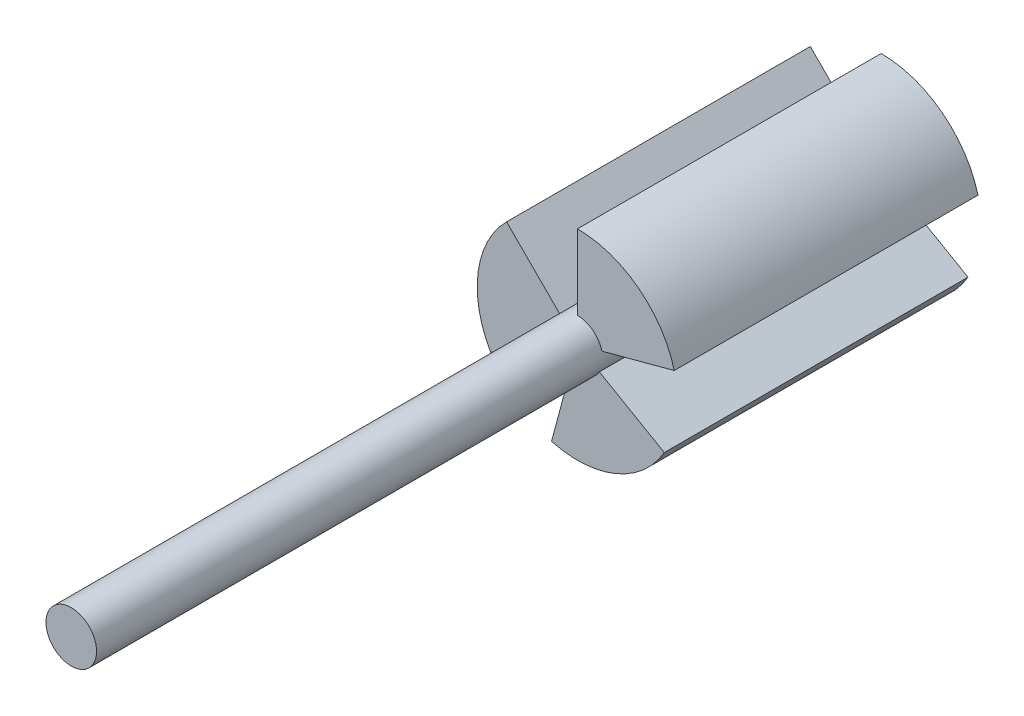
ISO-10303-21;
HEADER;
FILE_DESCRIPTION(('STEP AP214'),'2;1');
FILE_NAME('part.step','',(''),(''),'','','');
FILE_SCHEMA(('AUTOMOTIVE_DESIGN { 1 0 10303 214 1 1 1 1 }'));
ENDSEC;
DATA;
#1=APPLICATION_CONTEXT('core data for automotive mechanical design processes');
#2=APPLICATION_PROTOCOL_DEFINITION('international standard','automotive_design',2000,#1);
#3=PRODUCT_CONTEXT('',#1,'mechanical');
#4=PRODUCT('Part','Part','',(#3));
#5=PRODUCT_RELATED_PRODUCT_CATEGORY('part','',(#4));
#6=PRODUCT_DEFINITION_FORMATION('','',#4);
#7=PRODUCT_DEFINITION_CONTEXT('part definition',#1,'design');
#8=PRODUCT_DEFINITION('design','',#6,#7);
#9=PRODUCT_DEFINITION_SHAPE('','',#8);
#10=(LENGTH_UNIT() NAMED_UNIT(*) SI_UNIT(.MILLI.,.METRE.));
#11=(NAMED_UNIT(*) PLANE_ANGLE_UNIT() SI_UNIT($,.RADIAN.));
#12=(NAMED_UNIT(*) SI_UNIT($,.STERADIAN.) SOLID_ANGLE_UNIT());
#13=UNCERTAINTY_MEASURE_WITH_UNIT(LENGTH_MEASURE(1.E-05),#10,'distance_accuracy_value','');
#14=(GEOMETRIC_REPRESENTATION_CONTEXT(3) GLOBAL_UNCERTAINTY_ASSIGNED_CONTEXT((#13)) GLOBAL_UNIT_ASSIGNED_CONTEXT((#10,
#11,#12)) REPRESENTATION_CONTEXT('',''));
#15=CARTESIAN_POINT('',(0.,0.,0.));
#16=DIRECTION('',(0.,0.,1.));
#17=DIRECTION('',(1.,0.,0.));
#18=AXIS2_PLACEMENT_3D('',#15,#16,#17);
#19=CARTESIAN_POINT('',(0.,0.,762.));
#20=DIRECTION('',(0.,0.,1.));
#21=DIRECTION('',(1.,0.,0.));
#22=AXIS2_PLACEMENT_3D('',#19,#20,#21);
#23=PLANE('',#22);
#24=CARTESIAN_POINT('',(0.,0.,762.));
#25=DIRECTION('',(0.,0.,1.));
#26=DIRECTION('',(1.,0.,0.));
#27=AXIS2_PLACEMENT_3D('',#24,#25,#26);
#28=CIRCLE('',#27,63.5);
#29=CARTESIAN_POINT('',(61.336289969356,16.4350093640095,762.));
#30=VERTEX_POINT('',#29);
#31=CARTESIAN_POINT('',(0.,63.5,762.));
#32=VERTEX_POINT('',#31);
#33=EDGE_CURVE('E44',#30,#32,#28,.T.);
#34=ORIENTED_EDGE('',*,*,#33,.F.);
#35=DIRECTION('',(-0.965925826289071,-0.258819045102511,0.));
#36=VECTOR('',#35,1.);
#37=CARTESIAN_POINT('',(61.3362899693559,16.4350093640095,762.));
#38=LINE('',#37,#36);
#39=CARTESIAN_POINT('',(242.89170827865,65.0826370814776,762.));
#40=VERTEX_POINT('',#39);
#41=EDGE_CURVE('E129',#40,#30,#38,.T.);
#42=ORIENTED_EDGE('',*,*,#41,.F.);
#43=CARTESIAN_POINT('',(0.,0.,762.));
#44=DIRECTION('',(0.,0.,1.));
#45=DIRECTION('',(1.,0.,0.));
#46=AXIS2_PLACEMENT_3D('',#43,#44,#45);
#47=CIRCLE('',#46,251.46);
#48=CARTESIAN_POINT('',(0.,251.46,762.));
#49=VERTEX_POINT('',#48);
#50=EDGE_CURVE('E205',#40,#49,#47,.T.);
#51=ORIENTED_EDGE('',*,*,#50,.T.);
#52=DIRECTION('',(0.,1.,0.));
#53=VECTOR('',#52,1.);
#54=CARTESIAN_POINT('',(0.,251.46,762.));
#55=LINE('',#54,#53);
#56=EDGE_CURVE('E131',#32,#49,#55,.T.);
#57=ORIENTED_EDGE('',*,*,#56,.F.);
#58=EDGE_LOOP('',(#34,#42,#51,#57));
#59=FACE_BOUND('',#58,.T.);
#60=ADVANCED_FACE('F33',(#59),#23,.T.);
#61=CARTESIAN_POINT('',(-44.9012806053453,44.9012806053462,762.));
#62=VERTEX_POINT('',#61);
#63=CARTESIAN_POINT('',(-54.9926131403121,-31.7499999999995,762.));
#64=VERTEX_POINT('',#63);
#65=EDGE_CURVE('E11',#62,#64,#28,.T.);
#66=ORIENTED_EDGE('',*,*,#65,.F.);
#67=DIRECTION('',(0.70710678118654,-0.707106781186555,0.));
#68=VECTOR('',#67,1.);
#69=CARTESIAN_POINT('',(-44.9012806053453,44.9012806053462,762.));
#70=LINE('',#69,#68);
#71=CARTESIAN_POINT('',(-177.809071197167,177.809071197171,762.));
#72=VERTEX_POINT('',#71);
#73=EDGE_CURVE('E186',#72,#62,#70,.T.);
#74=ORIENTED_EDGE('',*,*,#73,.F.);
#75=CARTESIAN_POINT('',(-217.770748035636,-125.729999999998,762.));
#76=VERTEX_POINT('',#75);
#77=EDGE_CURVE('E206',#72,#76,#47,.T.);
#78=ORIENTED_EDGE('',*,*,#77,.T.);
#79=DIRECTION('',(-0.866025403784443,-0.499999999999992,0.));
#80=VECTOR('',#79,1.);
#81=CARTESIAN_POINT('',(-217.770748035636,-125.729999999998,762.));
#82=LINE('',#81,#80);
#83=EDGE_CURVE('E172',#64,#76,#82,.T.);
#84=ORIENTED_EDGE('',*,*,#83,.F.);
#85=EDGE_LOOP('',(#66,#74,#78,#84));
#86=FACE_BOUND('',#85,.T.);
#87=ADVANCED_FACE('F247',(#86),#23,.T.);
#88=CARTESIAN_POINT('',(0.,0.,762.));
#89=DIRECTION('',(0.,0.,-1.));
#90=DIRECTION('',(-1.,0.,0.));
#91=AXIS2_PLACEMENT_3D('',#88,#89,#90);
#92=CYLINDRICAL_SURFACE('',#91,251.46);
#93=CARTESIAN_POINT('',(-65.0826370814833,-242.891708278648,762.));
#94=VERTEX_POINT('',#93);
#95=CARTESIAN_POINT('',(217.770748035634,-125.730000000001,762.));
#96=VERTEX_POINT('',#95);
#97=EDGE_CURVE('E207',#94,#96,#47,.T.);
#98=ORIENTED_EDGE('',*,*,#97,.F.);
#99=DIRECTION('',(0.,0.,1.));
#100=VECTOR('',#99,1.);
#101=CARTESIAN_POINT('',(-65.0826370814833,-242.891708278648,0.));
#102=LINE('',#101,#100);
#103=CARTESIAN_POINT('',(-65.0826370814833,-242.891708278648,0.));
#104=VERTEX_POINT('',#103);
#105=EDGE_CURVE('E177',#104,#94,#102,.T.);
#106=ORIENTED_EDGE('',*,*,#105,.F.);
#107=CARTESIAN_POINT('',(0.,0.,0.));
#108=DIRECTION('',(0.,0.,1.));
#109=DIRECTION('',(1.,0.,0.));
#110=AXIS2_PLACEMENT_3D('',#107,#108,#109);
#111=CIRCLE('',#110,251.46);
#112=CARTESIAN_POINT('',(217.770748035634,-125.730000000001,0.));
#113=VERTEX_POINT('',#112);
#114=EDGE_CURVE('E199',#104,#113,#111,.T.);
#115=ORIENTED_EDGE('',*,*,#114,.T.);
#116=DIRECTION('',(0.,0.,1.));
#117=VECTOR('',#116,1.);
#118=CARTESIAN_POINT('',(217.770748035634,-125.730000000001,0.));
#119=LINE('',#118,#117);
#120=EDGE_CURVE('E51',#113,#96,#119,.T.);
#121=ORIENTED_EDGE('',*,*,#120,.T.);
#122=EDGE_LOOP('',(#98,#106,#115,#121));
#123=FACE_BOUND('',#122,.T.);
#124=ADVANCED_FACE('F223',(#123),#92,.T.);
#125=ORIENTED_EDGE('',*,*,#50,.F.);
#126=DIRECTION('',(0.,0.,1.));
#127=VECTOR('',#126,1.);
#128=CARTESIAN_POINT('',(242.89170827865,65.0826370814776,0.));
#129=LINE('',#128,#127);
#130=CARTESIAN_POINT('',(242.89170827865,65.0826370814776,0.));
#131=VERTEX_POINT('',#130);
#132=EDGE_CURVE('E144',#131,#40,#129,.T.);
#133=ORIENTED_EDGE('',*,*,#132,.F.);
#134=CARTESIAN_POINT('',(0.,251.46,0.));
#135=VERTEX_POINT('',#134);
#136=EDGE_CURVE('E37',#131,#135,#111,.T.);
#137=ORIENTED_EDGE('',*,*,#136,.T.);
#138=DIRECTION('',(0.,0.,1.));
#139=VECTOR('',#138,1.);
#140=CARTESIAN_POINT('',(0.,251.46,0.));
#141=LINE('',#140,#139);
#142=EDGE_CURVE('E202',#135,#49,#141,.T.);
#143=ORIENTED_EDGE('',*,*,#142,.T.);
#144=EDGE_LOOP('',(#125,#133,#137,#143));
#145=FACE_BOUND('',#144,.T.);
#146=ADVANCED_FACE('F261',(#145),#92,.T.);
#147=CARTESIAN_POINT('',(-177.809071197167,177.809071197171,0.));
#148=VERTEX_POINT('',#147);
#149=CARTESIAN_POINT('',(-217.770748035636,-125.729999999998,0.));
#150=VERTEX_POINT('',#149);
#151=EDGE_CURVE('E215',#148,#150,#111,.T.);
#152=ORIENTED_EDGE('',*,*,#151,.T.);
#153=DIRECTION('',(0.,0.,1.));
#154=VECTOR('',#153,1.);
#155=CARTESIAN_POINT('',(-217.770748035636,-125.729999999998,0.));
#156=LINE('',#155,#154);
#157=EDGE_CURVE('E59',#150,#76,#156,.T.);
#158=ORIENTED_EDGE('',*,*,#157,.T.);
#159=ORIENTED_EDGE('',*,*,#77,.F.);
#160=DIRECTION('',(0.,0.,1.));
#161=VECTOR('',#160,1.);
#162=CARTESIAN_POINT('',(-177.809071197167,177.809071197171,0.));
#163=LINE('',#162,#161);
#164=EDGE_CURVE('E200',#148,#72,#163,.T.);
#165=ORIENTED_EDGE('',*,*,#164,.F.);
#166=EDGE_LOOP('',(#152,#158,#159,#165));
#167=FACE_BOUND('',#166,.T.);
#168=ADVANCED_FACE('F35',(#167),#92,.T.);
#169=CARTESIAN_POINT('',(-16.4350093640109,-61.3362899693556,762.));
#170=VERTEX_POINT('',#169);
#171=CARTESIAN_POINT('',(54.9926131403116,-31.7500000000002,762.));
#172=VERTEX_POINT('',#171);
#173=EDGE_CURVE('E42',#170,#172,#28,.T.);
#174=ORIENTED_EDGE('',*,*,#173,.F.);
#175=DIRECTION('',(0.258819045102535,0.965925826289065,0.));
#176=VECTOR('',#175,1.);
#177=CARTESIAN_POINT('',(-16.4350093640109,-61.3362899693555,762.));
#178=LINE('',#177,#176);
#179=EDGE_CURVE('E166',#94,#170,#178,.T.);
#180=ORIENTED_EDGE('',*,*,#179,.F.);
#181=ORIENTED_EDGE('',*,*,#97,.T.);
#182=DIRECTION('',(0.866025403784436,-0.500000000000004,0.));
#183=VECTOR('',#182,1.);
#184=CARTESIAN_POINT('',(217.770748035634,-125.730000000001,762.));
#185=LINE('',#184,#183);
#186=EDGE_CURVE('E148',#172,#96,#185,.T.);
#187=ORIENTED_EDGE('',*,*,#186,.F.);
#188=EDGE_LOOP('',(#174,#180,#181,#187));
#189=FACE_BOUND('',#188,.T.);
#190=ADVANCED_FACE('F249',(#189),#23,.T.);
#191=CARTESIAN_POINT('',(0.,0.,0.));
#192=DIRECTION('',(0.,0.,1.));
#193=DIRECTION('',(1.,0.,0.));
#194=AXIS2_PLACEMENT_3D('',#191,#192,#193);
#195=PLANE('',#194);
#196=ORIENTED_EDGE('',*,*,#114,.F.);
#197=DIRECTION('',(0.258819045102535,0.965925826289065,0.));
#198=VECTOR('',#197,1.);
#199=CARTESIAN_POINT('',(-16.4350093640109,-61.3362899693555,0.));
#200=LINE('',#199,#198);
#201=CARTESIAN_POINT('',(-16.4350093640109,-61.3362899693555,0.));
#202=VERTEX_POINT('',#201);
#203=EDGE_CURVE('E168',#104,#202,#200,.T.);
#204=ORIENTED_EDGE('',*,*,#203,.T.);
#205=CARTESIAN_POINT('',(0.,0.,0.));
#206=DIRECTION('',(0.,0.,-1.));
#207=DIRECTION('',(1.,0.,0.));
#208=AXIS2_PLACEMENT_3D('',#205,#206,#207);
#209=CIRCLE('',#208,63.4999999999999);
#210=CARTESIAN_POINT('',(-54.992613140312,-31.7499999999994,0.));
#211=VERTEX_POINT('',#210);
#212=EDGE_CURVE('E162',#202,#211,#209,.T.);
#213=ORIENTED_EDGE('',*,*,#212,.T.);
#214=DIRECTION('',(-0.866025403784443,-0.499999999999992,0.));
#215=VECTOR('',#214,1.);
#216=CARTESIAN_POINT('',(-217.770748035636,-125.729999999998,0.));
#217=LINE('',#216,#215);
#218=EDGE_CURVE('E165',#211,#150,#217,.T.);
#219=ORIENTED_EDGE('',*,*,#218,.T.);
#220=ORIENTED_EDGE('',*,*,#151,.F.);
#221=DIRECTION('',(0.70710678118654,-0.707106781186555,0.));
#222=VECTOR('',#221,1.);
#223=CARTESIAN_POINT('',(-44.9012806053453,44.9012806053462,0.));
#224=LINE('',#223,#222);
#225=CARTESIAN_POINT('',(-44.9012806053453,44.9012806053462,0.));
#226=VERTEX_POINT('',#225);
#227=EDGE_CURVE('E189',#148,#226,#224,.T.);
#228=ORIENTED_EDGE('',*,*,#227,.T.);
#229=CARTESIAN_POINT('',(0.,0.,0.));
#230=DIRECTION('',(0.,0.,-1.));
#231=DIRECTION('',(1.,0.,0.));
#232=AXIS2_PLACEMENT_3D('',#229,#230,#231);
#233=CIRCLE('',#232,63.5);
#234=CARTESIAN_POINT('',(0.,63.5,0.));
#235=VERTEX_POINT('',#234);
#236=EDGE_CURVE('E182',#226,#235,#233,.T.);
#237=ORIENTED_EDGE('',*,*,#236,.T.);
#238=DIRECTION('',(0.,1.,0.));
#239=VECTOR('',#238,1.);
#240=CARTESIAN_POINT('',(0.,251.46,0.));
#241=LINE('',#240,#239);
#242=EDGE_CURVE('E185',#235,#135,#241,.T.);
#243=ORIENTED_EDGE('',*,*,#242,.T.);
#244=ORIENTED_EDGE('',*,*,#136,.F.);
#245=DIRECTION('',(-0.965925826289071,-0.258819045102511,0.));
#246=VECTOR('',#245,1.);
#247=CARTESIAN_POINT('',(61.3362899693559,16.4350093640095,0.));
#248=LINE('',#247,#246);
#249=CARTESIAN_POINT('',(61.3362899693559,16.4350093640095,0.));
#250=VERTEX_POINT('',#249);
#251=EDGE_CURVE('E161',#131,#250,#248,.T.);
#252=ORIENTED_EDGE('',*,*,#251,.T.);
#253=CARTESIAN_POINT('',(0.,0.,0.));
#254=DIRECTION('',(0.,0.,-1.));
#255=DIRECTION('',(1.,0.,0.));
#256=AXIS2_PLACEMENT_3D('',#253,#254,#255);
#257=CIRCLE('',#256,63.4999999999999);
#258=CARTESIAN_POINT('',(54.9926131403116,-31.7500000000002,0.));
#259=VERTEX_POINT('',#258);
#260=EDGE_CURVE('E141',#250,#259,#257,.T.);
#261=ORIENTED_EDGE('',*,*,#260,.T.);
#262=DIRECTION('',(0.866025403784436,-0.500000000000004,0.));
#263=VECTOR('',#262,1.);
#264=CARTESIAN_POINT('',(217.770748035634,-125.730000000001,0.));
#265=LINE('',#264,#263);
#266=EDGE_CURVE('E150',#259,#113,#265,.T.);
#267=ORIENTED_EDGE('',*,*,#266,.T.);
#268=EDGE_LOOP('',(#196,#204,#213,#219,#220,#228,#237,#243,#244,#252,#261,#267));
#269=FACE_BOUND('',#268,.T.);
#270=ADVANCED_FACE('F225',(#269),#195,.F.);
#271=CARTESIAN_POINT('',(-44.9012806053453,44.9012806053462,0.));
#272=DIRECTION('',(-0.707106781186555,-0.70710678118654,0.));
#273=DIRECTION('',(0.70710678118654,-0.707106781186555,0.));
#274=AXIS2_PLACEMENT_3D('',#271,#272,#273);
#275=PLANE('',#274);
#276=ORIENTED_EDGE('',*,*,#73,.T.);
#277=DIRECTION('',(0.,0.,1.));
#278=VECTOR('',#277,1.);
#279=CARTESIAN_POINT('',(-44.9012806053453,44.9012806053462,0.));
#280=LINE('',#279,#278);
#281=EDGE_CURVE('E196',#226,#62,#280,.T.);
#282=ORIENTED_EDGE('',*,*,#281,.F.);
#283=ORIENTED_EDGE('',*,*,#227,.F.);
#284=ORIENTED_EDGE('',*,*,#164,.T.);
#285=EDGE_LOOP('',(#276,#282,#283,#284));
#286=FACE_BOUND('',#285,.T.);
#287=ADVANCED_FACE('F260',(#286),#275,.F.);
#288=CARTESIAN_POINT('',(0.,251.46,0.));
#289=DIRECTION('',(1.,0.,0.));
#290=DIRECTION('',(0.,0.,-1.));
#291=AXIS2_PLACEMENT_3D('',#288,#289,#290);
#292=PLANE('',#291);
#293=ORIENTED_EDGE('',*,*,#56,.T.);
#294=ORIENTED_EDGE('',*,*,#142,.F.);
#295=ORIENTED_EDGE('',*,*,#242,.F.);
#296=DIRECTION('',(0.,0.,1.));
#297=VECTOR('',#296,1.);
#298=CARTESIAN_POINT('',(0.,63.5,0.));
#299=LINE('',#298,#297);
#300=EDGE_CURVE('E192',#235,#32,#299,.T.);
#301=ORIENTED_EDGE('',*,*,#300,.T.);
#302=EDGE_LOOP('',(#293,#294,#295,#301));
#303=FACE_BOUND('',#302,.T.);
#304=ADVANCED_FACE('F273',(#303),#292,.F.);
#305=CARTESIAN_POINT('',(61.3362899693559,16.4350093640095,0.));
#306=DIRECTION('',(-0.258819045102511,0.965925826289071,0.));
#307=DIRECTION('',(-0.965925826289071,-0.258819045102511,0.));
#308=AXIS2_PLACEMENT_3D('',#305,#306,#307);
#309=PLANE('',#308);
#310=ORIENTED_EDGE('',*,*,#41,.T.);
#311=DIRECTION('',(0.,0.,1.));
#312=VECTOR('',#311,1.);
#313=CARTESIAN_POINT('',(61.3362899693559,16.4350093640095,0.));
#314=LINE('',#313,#312);
#315=EDGE_CURVE('E136',#250,#30,#314,.T.);
#316=ORIENTED_EDGE('',*,*,#315,.F.);
#317=ORIENTED_EDGE('',*,*,#251,.F.);
#318=ORIENTED_EDGE('',*,*,#132,.T.);
#319=EDGE_LOOP('',(#310,#316,#317,#318));
#320=FACE_BOUND('',#319,.T.);
#321=ADVANCED_FACE('F146',(#320),#309,.F.);
#322=CARTESIAN_POINT('',(217.770748035634,-125.730000000001,0.));
#323=DIRECTION('',(-0.500000000000004,-0.866025403784436,0.));
#324=DIRECTION('',(0.866025403784436,-0.500000000000004,0.));
#325=AXIS2_PLACEMENT_3D('',#322,#323,#324);
#326=PLANE('',#325);
#327=ORIENTED_EDGE('',*,*,#186,.T.);
#328=ORIENTED_EDGE('',*,*,#120,.F.);
#329=ORIENTED_EDGE('',*,*,#266,.F.);
#330=DIRECTION('',(0.,0.,1.));
#331=VECTOR('',#330,1.);
#332=CARTESIAN_POINT('',(54.9926131403116,-31.7500000000002,0.));
#333=LINE('',#332,#331);
#334=EDGE_CURVE('E158',#259,#172,#333,.T.);
#335=ORIENTED_EDGE('',*,*,#334,.T.);
#336=EDGE_LOOP('',(#327,#328,#329,#335));
#337=FACE_BOUND('',#336,.T.);
#338=ADVANCED_FACE('F234',(#337),#326,.F.);
#339=CARTESIAN_POINT('',(0.,0.,0.));
#340=DIRECTION('',(0.,0.,1.));
#341=DIRECTION('',(1.,0.,0.));
#342=AXIS2_PLACEMENT_3D('',#339,#340,#341);
#343=CYLINDRICAL_SURFACE('',#342,63.4999999999999);
#344=DIRECTION('',(0.,0.,1.));
#345=VECTOR('',#344,1.);
#346=CARTESIAN_POINT('',(-16.4350093640109,-61.3362899693555,0.));
#347=LINE('',#346,#345);
#348=EDGE_CURVE('E152',#202,#170,#347,.T.);
#349=ORIENTED_EDGE('',*,*,#348,.T.);
#350=ORIENTED_EDGE('',*,*,#173,.T.);
#351=ORIENTED_EDGE('',*,*,#334,.F.);
#352=ORIENTED_EDGE('',*,*,#260,.F.);
#353=ORIENTED_EDGE('',*,*,#315,.T.);
#354=ORIENTED_EDGE('',*,*,#33,.T.);
#355=ORIENTED_EDGE('',*,*,#300,.F.);
#356=ORIENTED_EDGE('',*,*,#236,.F.);
#357=ORIENTED_EDGE('',*,*,#281,.T.);
#358=ORIENTED_EDGE('',*,*,#65,.T.);
#359=DIRECTION('',(0.,0.,1.));
#360=VECTOR('',#359,1.);
#361=CARTESIAN_POINT('',(-54.992613140312,-31.7499999999994,0.));
#362=LINE('',#361,#360);
#363=EDGE_CURVE('E171',#211,#64,#362,.T.);
#364=ORIENTED_EDGE('',*,*,#363,.F.);
#365=ORIENTED_EDGE('',*,*,#212,.F.);
#366=EDGE_LOOP('',(#349,#350,#351,#352,#353,#354,#355,#356,#357,#358,#364,#365));
#367=FACE_BOUND('',#366,.T.);
#368=CARTESIAN_POINT('',(0.,0.,2032.));
#369=DIRECTION('',(0.,0.,1.));
#370=DIRECTION('',(1.,0.,0.));
#371=AXIS2_PLACEMENT_3D('',#368,#369,#370);
#372=CIRCLE('',#371,63.5);
#373=CARTESIAN_POINT('',(63.5,0.,2032.));
#374=VERTEX_POINT('',#373);
#375=EDGE_CURVE('E134',#374,#374,#372,.T.);
#376=ORIENTED_EDGE('',*,*,#375,.F.);
#377=EDGE_LOOP('',(#376));
#378=FACE_BOUND('',#377,.T.);
#379=ADVANCED_FACE('F138',(#367,#378),#343,.T.);
#380=CARTESIAN_POINT('',(-16.4350093640109,-61.3362899693555,0.));
#381=DIRECTION('',(0.965925826289064,-0.258819045102535,0.));
#382=DIRECTION('',(0.258819045102535,0.965925826289065,0.));
#383=AXIS2_PLACEMENT_3D('',#380,#381,#382);
#384=PLANE('',#383);
#385=ORIENTED_EDGE('',*,*,#179,.T.);
#386=ORIENTED_EDGE('',*,*,#348,.F.);
#387=ORIENTED_EDGE('',*,*,#203,.F.);
#388=ORIENTED_EDGE('',*,*,#105,.T.);
#389=EDGE_LOOP('',(#385,#386,#387,#388));
#390=FACE_BOUND('',#389,.T.);
#391=ADVANCED_FACE('F233',(#390),#384,.F.);
#392=CARTESIAN_POINT('',(-217.770748035636,-125.729999999998,0.));
#393=DIRECTION('',(-0.499999999999992,0.866025403784443,0.));
#394=DIRECTION('',(-0.866025403784443,-0.499999999999992,0.));
#395=AXIS2_PLACEMENT_3D('',#392,#393,#394);
#396=PLANE('',#395);
#397=ORIENTED_EDGE('',*,*,#83,.T.);
#398=ORIENTED_EDGE('',*,*,#157,.F.);
#399=ORIENTED_EDGE('',*,*,#218,.F.);
#400=ORIENTED_EDGE('',*,*,#363,.T.);
#401=EDGE_LOOP('',(#397,#398,#399,#400));
#402=FACE_BOUND('',#401,.T.);
#403=ADVANCED_FACE('F240',(#402),#396,.F.);
#404=CARTESIAN_POINT('',(0.,0.,2032.));
#405=DIRECTION('',(0.,0.,1.));
#406=DIRECTION('',(1.,0.,0.));
#407=AXIS2_PLACEMENT_3D('',#404,#405,#406);
#408=PLANE('',#407);
#409=ORIENTED_EDGE('',*,*,#375,.T.);
#410=EDGE_LOOP('',(#409));
#411=FACE_BOUND('',#410,.T.);
#412=ADVANCED_FACE('F231',(#411),#408,.T.);
#413=CLOSED_SHELL('',(#60,#87,#124,#146,#168,#190,#270,#287,#304,#321,#338,#379,#391,#403,#412));
#414=MANIFOLD_SOLID_BREP('B2',#413);
#415=ADVANCED_BREP_SHAPE_REPRESENTATION('',(#18,#414),#14);
#416=SHAPE_DEFINITION_REPRESENTATION(#9,#415);
ENDSEC;
END-ISO-10303-21;
